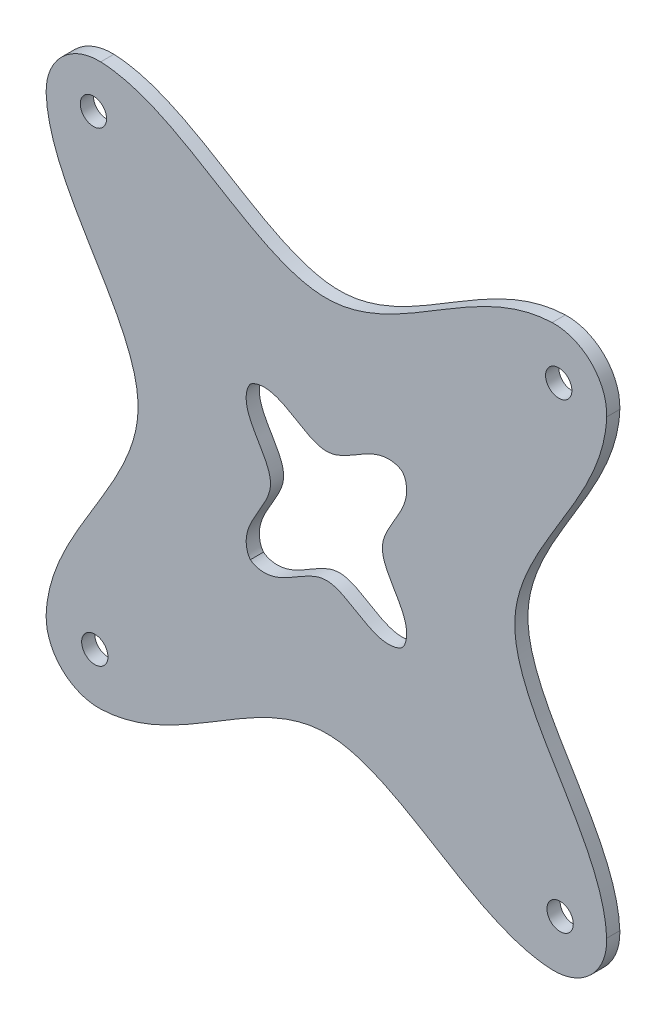
ISO-10303-21;
HEADER;
FILE_DESCRIPTION(('STEP AP214'),'2;1');
FILE_NAME('part.step','',(''),(''),'','','');
FILE_SCHEMA(('AUTOMOTIVE_DESIGN { 1 0 10303 214 1 1 1 1 }'));
ENDSEC;
DATA;
#1=APPLICATION_CONTEXT('core data for automotive mechanical design processes');
#2=APPLICATION_PROTOCOL_DEFINITION('international standard','automotive_design',2000,#1);
#3=PRODUCT_CONTEXT('',#1,'mechanical');
#4=PRODUCT('Part','Part','',(#3));
#5=PRODUCT_RELATED_PRODUCT_CATEGORY('part','',(#4));
#6=PRODUCT_DEFINITION_FORMATION('','',#4);
#7=PRODUCT_DEFINITION_CONTEXT('part definition',#1,'design');
#8=PRODUCT_DEFINITION('design','',#6,#7);
#9=PRODUCT_DEFINITION_SHAPE('','',#8);
#10=(LENGTH_UNIT() NAMED_UNIT(*) SI_UNIT(.MILLI.,.METRE.));
#11=(NAMED_UNIT(*) PLANE_ANGLE_UNIT() SI_UNIT($,.RADIAN.));
#12=(NAMED_UNIT(*) SI_UNIT($,.STERADIAN.) SOLID_ANGLE_UNIT());
#13=UNCERTAINTY_MEASURE_WITH_UNIT(LENGTH_MEASURE(1.E-05),#10,'distance_accuracy_value','');
#14=(GEOMETRIC_REPRESENTATION_CONTEXT(3) GLOBAL_UNCERTAINTY_ASSIGNED_CONTEXT((#13)) GLOBAL_UNIT_ASSIGNED_CONTEXT((#10,
#11,#12)) REPRESENTATION_CONTEXT('',''));
#15=CARTESIAN_POINT('',(0.,0.,0.));
#16=DIRECTION('',(0.,0.,1.));
#17=DIRECTION('',(1.,0.,0.));
#18=AXIS2_PLACEMENT_3D('',#15,#16,#17);
#19=CARTESIAN_POINT('',(21.9654081761549,-21.9654081758046,0.));
#20=DIRECTION('',(0.,0.,-1.));
#21=DIRECTION('',(-1.,0.,0.));
#22=AXIS2_PLACEMENT_3D('',#19,#20,#21);
#23=CYLINDRICAL_SURFACE('',#22,5.08);
#24=DIRECTION('',(0.,0.,-1.));
#25=VECTOR('',#24,1.);
#26=CARTESIAN_POINT('',(21.7825332933206,-27.0421154528917,0.));
#27=LINE('',#26,#25);
#28=CARTESIAN_POINT('',(21.7825332933206,-27.0421154528917,0.));
#29=VERTEX_POINT('',#28);
#30=CARTESIAN_POINT('',(21.7825332933206,-27.0421154528917,1.27));
#31=VERTEX_POINT('',#30);
#32=EDGE_CURVE('E259',#29,#31,#27,.F.);
#33=ORIENTED_EDGE('',*,*,#32,.F.);
#34=CARTESIAN_POINT('',(21.9654081761549,-21.9654081758046,0.));
#35=DIRECTION('',(0.,0.,1.));
#36=DIRECTION('',(1.,0.,0.));
#37=AXIS2_PLACEMENT_3D('',#34,#35,#36);
#38=CIRCLE('',#37,5.08);
#39=CARTESIAN_POINT('',(27.0421154532867,-21.782533294215,0.));
#40=VERTEX_POINT('',#39);
#41=EDGE_CURVE('E40',#40,#29,#38,.F.);
#42=ORIENTED_EDGE('',*,*,#41,.F.);
#43=DIRECTION('',(0.,0.,-1.));
#44=VECTOR('',#43,1.);
#45=CARTESIAN_POINT('',(27.0421154532867,-21.782533294215,1.27));
#46=LINE('',#45,#44);
#47=CARTESIAN_POINT('',(27.0421154532867,-21.782533294215,1.27));
#48=VERTEX_POINT('',#47);
#49=EDGE_CURVE('E262',#48,#40,#46,.T.);
#50=ORIENTED_EDGE('',*,*,#49,.F.);
#51=CARTESIAN_POINT('',(21.9654081761549,-21.9654081758046,1.27));
#52=DIRECTION('',(0.,0.,1.));
#53=DIRECTION('',(1.,0.,0.));
#54=AXIS2_PLACEMENT_3D('',#51,#52,#53);
#55=CIRCLE('',#54,5.08);
#56=EDGE_CURVE('E11',#31,#48,#55,.T.);
#57=ORIENTED_EDGE('',*,*,#56,.F.);
#58=EDGE_LOOP('',(#33,#42,#50,#57));
#59=FACE_BOUND('',#58,.T.);
#60=ADVANCED_FACE('F33',(#59),#23,.T.);
#61=CARTESIAN_POINT('',(-21.9654081757839,21.965408175578,1.27));
#62=DIRECTION('',(0.,0.,-1.));
#63=DIRECTION('',(-1.,0.,0.));
#64=AXIS2_PLACEMENT_3D('',#61,#62,#63);
#65=CYLINDRICAL_SURFACE('',#64,5.08);
#66=DIRECTION('',(0.,0.,-1.));
#67=VECTOR('',#66,1.);
#68=CARTESIAN_POINT('',(-27.0421154528519,21.7825332922171,1.27));
#69=LINE('',#68,#67);
#70=CARTESIAN_POINT('',(-27.0421154528519,21.7825332922171,1.27));
#71=VERTEX_POINT('',#70);
#72=CARTESIAN_POINT('',(-27.0421154528519,21.7825332922171,0.));
#73=VERTEX_POINT('',#72);
#74=EDGE_CURVE('E249',#71,#73,#69,.T.);
#75=ORIENTED_EDGE('',*,*,#74,.F.);
#76=CARTESIAN_POINT('',(-21.9654081757839,21.965408175578,1.27));
#77=DIRECTION('',(0.,0.,1.));
#78=DIRECTION('',(1.,0.,0.));
#79=AXIS2_PLACEMENT_3D('',#76,#77,#78);
#80=CIRCLE('',#79,5.08);
#81=CARTESIAN_POINT('',(-21.7825332916942,27.0421154526198,1.27));
#82=VERTEX_POINT('',#81);
#83=EDGE_CURVE('E255',#82,#71,#80,.T.);
#84=ORIENTED_EDGE('',*,*,#83,.F.);
#85=DIRECTION('',(0.,0.,-1.));
#86=VECTOR('',#85,1.);
#87=CARTESIAN_POINT('',(-21.7825332916942,27.0421154526198,0.));
#88=LINE('',#87,#86);
#89=CARTESIAN_POINT('',(-21.7825332916942,27.0421154526198,0.));
#90=VERTEX_POINT('',#89);
#91=EDGE_CURVE('E252',#90,#82,#88,.F.);
#92=ORIENTED_EDGE('',*,*,#91,.F.);
#93=CARTESIAN_POINT('',(-21.9654081757839,21.965408175578,0.));
#94=DIRECTION('',(0.,0.,1.));
#95=DIRECTION('',(1.,0.,0.));
#96=AXIS2_PLACEMENT_3D('',#93,#94,#95);
#97=CIRCLE('',#96,5.08);
#98=EDGE_CURVE('E257',#73,#90,#97,.F.);
#99=ORIENTED_EDGE('',*,*,#98,.F.);
#100=EDGE_LOOP('',(#75,#84,#92,#99));
#101=FACE_BOUND('',#100,.T.);
#102=ADVANCED_FACE('F288',(#101),#65,.T.);
#103=CARTESIAN_POINT('',(-21.9654081755703,-21.9654081755702,1.27));
#104=DIRECTION('',(0.,0.,-1.));
#105=DIRECTION('',(-1.,0.,0.));
#106=AXIS2_PLACEMENT_3D('',#103,#104,#105);
#107=CYLINDRICAL_SURFACE('',#106,5.08);
#108=DIRECTION('',(0.,0.,-1.));
#109=VECTOR('',#108,1.);
#110=CARTESIAN_POINT('',(-21.7825332912855,-27.042115452605,1.27));
#111=LINE('',#110,#109);
#112=CARTESIAN_POINT('',(-21.7825332912855,-27.042115452605,1.27));
#113=VERTEX_POINT('',#112);
#114=CARTESIAN_POINT('',(-21.7825332912855,-27.042115452605,0.));
#115=VERTEX_POINT('',#114);
#116=EDGE_CURVE('E238',#113,#115,#111,.T.);
#117=ORIENTED_EDGE('',*,*,#116,.F.);
#118=CARTESIAN_POINT('',(-21.9654081755703,-21.9654081755702,1.27));
#119=DIRECTION('',(0.,0.,1.));
#120=DIRECTION('',(1.,0.,0.));
#121=AXIS2_PLACEMENT_3D('',#118,#119,#120);
#122=CIRCLE('',#121,5.08);
#123=CARTESIAN_POINT('',(-27.042115452605,-21.7825332912856,1.27));
#124=VERTEX_POINT('',#123);
#125=EDGE_CURVE('E244',#124,#113,#122,.T.);
#126=ORIENTED_EDGE('',*,*,#125,.F.);
#127=DIRECTION('',(0.,0.,-1.));
#128=VECTOR('',#127,1.);
#129=CARTESIAN_POINT('',(-27.042115452605,-21.7825332912856,0.));
#130=LINE('',#129,#128);
#131=CARTESIAN_POINT('',(-27.042115452605,-21.7825332912856,0.));
#132=VERTEX_POINT('',#131);
#133=EDGE_CURVE('E241',#132,#124,#130,.F.);
#134=ORIENTED_EDGE('',*,*,#133,.F.);
#135=CARTESIAN_POINT('',(-21.9654081755703,-21.9654081755702,0.));
#136=DIRECTION('',(0.,0.,1.));
#137=DIRECTION('',(1.,0.,0.));
#138=AXIS2_PLACEMENT_3D('',#135,#136,#137);
#139=CIRCLE('',#138,5.08);
#140=EDGE_CURVE('E246',#115,#132,#139,.F.);
#141=ORIENTED_EDGE('',*,*,#140,.F.);
#142=EDGE_LOOP('',(#117,#126,#134,#141));
#143=FACE_BOUND('',#142,.T.);
#144=ADVANCED_FACE('F278',(#143),#107,.T.);
#145=CARTESIAN_POINT('',(21.965408175107,21.9654081757669,0.));
#146=DIRECTION('',(0.,0.,-1.));
#147=DIRECTION('',(-1.,0.,0.));
#148=AXIS2_PLACEMENT_3D('',#145,#146,#147);
#149=CYLINDRICAL_SURFACE('',#148,5.08);
#150=DIRECTION('',(0.,0.,-1.));
#151=VECTOR('',#150,1.);
#152=CARTESIAN_POINT('',(27.0421154520755,21.7825332896429,0.));
#153=LINE('',#152,#151);
#154=CARTESIAN_POINT('',(27.0421154520755,21.7825332896429,0.));
#155=VERTEX_POINT('',#154);
#156=CARTESIAN_POINT('',(27.0421154520755,21.7825332896429,1.27));
#157=VERTEX_POINT('',#156);
#158=EDGE_CURVE('E187',#155,#157,#153,.F.);
#159=ORIENTED_EDGE('',*,*,#158,.F.);
#160=CARTESIAN_POINT('',(21.965408175107,21.9654081757669,0.));
#161=DIRECTION('',(0.,0.,1.));
#162=DIRECTION('',(1.,0.,0.));
#163=AXIS2_PLACEMENT_3D('',#160,#161,#162);
#164=CIRCLE('',#163,5.08);
#165=CARTESIAN_POINT('',(21.7825332913162,27.0421154528195,0.));
#166=VERTEX_POINT('',#165);
#167=EDGE_CURVE('E233',#166,#155,#164,.F.);
#168=ORIENTED_EDGE('',*,*,#167,.F.);
#169=DIRECTION('',(0.,0.,-1.));
#170=VECTOR('',#169,1.);
#171=CARTESIAN_POINT('',(21.7825332913162,27.0421154528195,1.27));
#172=LINE('',#171,#170);
#173=CARTESIAN_POINT('',(21.7825332913162,27.0421154528195,1.27));
#174=VERTEX_POINT('',#173);
#175=EDGE_CURVE('E230',#174,#166,#172,.T.);
#176=ORIENTED_EDGE('',*,*,#175,.F.);
#177=CARTESIAN_POINT('',(21.965408175107,21.9654081757669,1.27));
#178=DIRECTION('',(0.,0.,1.));
#179=DIRECTION('',(1.,0.,0.));
#180=AXIS2_PLACEMENT_3D('',#177,#178,#179);
#181=CIRCLE('',#180,5.08);
#182=EDGE_CURVE('E236',#157,#174,#181,.T.);
#183=ORIENTED_EDGE('',*,*,#182,.F.);
#184=EDGE_LOOP('',(#159,#168,#176,#183));
#185=FACE_BOUND('',#184,.T.);
#186=ADVANCED_FACE('F294',(#185),#149,.T.);
#187=CARTESIAN_POINT('',(-26.0784512242138,26.0784512242138,1.27));
#188=CARTESIAN_POINT('',(-26.4668926901077,25.5950306717712,1.27));
#189=CARTESIAN_POINT('',(-29.5054367703831,16.2013722905775,1.27));
#190=CARTESIAN_POINT('',(-7.63665032782753,4.97957528785472E-10,1.27));
#191=CARTESIAN_POINT('',(-29.505436769622,-16.2013722917142,1.27));
#192=CARTESIAN_POINT('',(-26.4668926901906,-25.5950306717568,1.27));
#193=CARTESIAN_POINT('',(-26.0784512242138,-26.0784512242138,1.27));
#194=B_SPLINE_CURVE_WITH_KNOTS('',3,(#187,#188,#189,#190,#191,#192,#193),.UNSPECIFIED.,.F.,.F.,
(4,1,1,1,4),(0.0327667540954913,0.0655335081872653,0.49999999999634,0.934466491805415,
0.967233245900849),.UNSPECIFIED.);
#195=DIRECTION('',(0.,0.,-1.));
#196=VECTOR('',#195,1.);
#197=SURFACE_OF_LINEAR_EXTRUSION('',#194,#196);
#198=EDGE_CURVE('E224',#71,#124,#194,.T.);
#199=ORIENTED_EDGE('',*,*,#198,.F.);
#200=ORIENTED_EDGE('',*,*,#74,.T.);
#201=CARTESIAN_POINT('',(-26.0784512242138,26.0784512242138,0.));
#202=CARTESIAN_POINT('',(-26.4668926901077,25.5950306717712,0.));
#203=CARTESIAN_POINT('',(-29.5054367703831,16.2013722905775,0.));
#204=CARTESIAN_POINT('',(-7.63665032782753,4.97957528785472E-10,0.));
#205=CARTESIAN_POINT('',(-29.505436769622,-16.2013722917142,0.));
#206=CARTESIAN_POINT('',(-26.4668926901906,-25.5950306717568,0.));
#207=CARTESIAN_POINT('',(-26.0784512242138,-26.0784512242138,0.));
#208=B_SPLINE_CURVE_WITH_KNOTS('',3,(#201,#202,#203,#204,#205,#206,#207),.UNSPECIFIED.,.F.,.F.,
(4,1,1,1,4),(0.0327667540954913,0.0655335081872653,0.49999999999634,0.934466491805415,
0.967233245900849),.UNSPECIFIED.);
#209=EDGE_CURVE('E193',#73,#132,#208,.T.);
#210=ORIENTED_EDGE('',*,*,#209,.T.);
#211=ORIENTED_EDGE('',*,*,#133,.T.);
#212=EDGE_LOOP('',(#199,#200,#210,#211));
#213=FACE_BOUND('',#212,.T.);
#214=ADVANCED_FACE('F285',(#213),#197,.F.);
#215=CARTESIAN_POINT('',(-26.0784512242138,-26.0784512242138,1.27));
#216=CARTESIAN_POINT('',(-25.5950306717568,-26.4668926901906,1.27));
#217=CARTESIAN_POINT('',(-16.2013722917143,-29.5054367696219,1.27));
#218=CARTESIAN_POINT('',(4.97995116026007E-10,-7.63665032782758,1.27));
#219=CARTESIAN_POINT('',(16.2013722905775,-29.505436770383,1.27));
#220=CARTESIAN_POINT('',(25.5950306717712,-26.4668926901077,1.27));
#221=CARTESIAN_POINT('',(26.0784512242138,-26.0784512242138,1.27));
#222=B_SPLINE_CURVE_WITH_KNOTS('',3,(#215,#216,#217,#218,#219,#220,#221),.UNSPECIFIED.,.F.,.F.,
(4,1,1,1,4),(0.0327667540954913,0.0655335081909255,0.5,0.934466491809075,0.967233245900849),.UNSPECIFIED.);
#223=DIRECTION('',(0.,0.,-1.));
#224=VECTOR('',#223,1.);
#225=SURFACE_OF_LINEAR_EXTRUSION('',#222,#224);
#226=CARTESIAN_POINT('',(-26.0784512242138,-26.0784512242138,0.));
#227=CARTESIAN_POINT('',(-25.5950306717568,-26.4668926901906,0.));
#228=CARTESIAN_POINT('',(-16.2013722917143,-29.5054367696219,0.));
#229=CARTESIAN_POINT('',(4.97995116026007E-10,-7.63665032782758,0.));
#230=CARTESIAN_POINT('',(16.2013722905775,-29.505436770383,0.));
#231=CARTESIAN_POINT('',(25.5950306717712,-26.4668926901077,0.));
#232=CARTESIAN_POINT('',(26.0784512242138,-26.0784512242138,0.));
#233=B_SPLINE_CURVE_WITH_KNOTS('',3,(#226,#227,#228,#229,#230,#231,#232),.UNSPECIFIED.,.F.,.F.,
(4,1,1,1,4),(0.0327667540954913,0.0655335081909255,0.5,0.934466491809075,0.967233245900849),.UNSPECIFIED.);
#234=EDGE_CURVE('E200',#115,#29,#233,.T.);
#235=ORIENTED_EDGE('',*,*,#234,.T.);
#236=ORIENTED_EDGE('',*,*,#32,.T.);
#237=EDGE_CURVE('E275',#113,#31,#222,.T.);
#238=ORIENTED_EDGE('',*,*,#237,.F.);
#239=ORIENTED_EDGE('',*,*,#116,.T.);
#240=EDGE_LOOP('',(#235,#236,#238,#239));
#241=FACE_BOUND('',#240,.T.);
#242=ADVANCED_FACE('F273',(#241),#225,.F.);
#243=CARTESIAN_POINT('',(26.0784512242138,-26.0784512242138,1.27));
#244=CARTESIAN_POINT('',(26.4668926899683,-25.5950306717962,1.27));
#245=CARTESIAN_POINT('',(29.5054367716601,-16.201372288648,1.27));
#246=CARTESIAN_POINT('',(7.63665032804387,-2.44868862485965E-09,1.27));
#247=CARTESIAN_POINT('',(29.5054367679272,16.2013722942378,1.27));
#248=CARTESIAN_POINT('',(26.4668926903748,25.5950306717246,1.27));
#249=CARTESIAN_POINT('',(26.0784512242138,26.0784512242138,1.27));
#250=B_SPLINE_CURVE_WITH_KNOTS('',3,(#243,#244,#245,#246,#247,#248,#249),.UNSPECIFIED.,.F.,.F.,
(4,1,1,1,4),(0.0327667541053309,0.0655335081909253,0.5,0.934466491809075,0.967233245912644),.UNSPECIFIED.);
#251=DIRECTION('',(0.,0.,-1.));
#252=VECTOR('',#251,1.);
#253=SURFACE_OF_LINEAR_EXTRUSION('',#250,#252);
#254=EDGE_CURVE('E188',#48,#157,#250,.T.);
#255=ORIENTED_EDGE('',*,*,#254,.F.);
#256=ORIENTED_EDGE('',*,*,#49,.T.);
#257=CARTESIAN_POINT('',(26.0784512242138,-26.0784512242138,0.));
#258=CARTESIAN_POINT('',(26.4668926899683,-25.5950306717962,0.));
#259=CARTESIAN_POINT('',(29.5054367716601,-16.201372288648,0.));
#260=CARTESIAN_POINT('',(7.63665032804387,-2.44868862485965E-09,0.));
#261=CARTESIAN_POINT('',(29.5054367679272,16.2013722942378,0.));
#262=CARTESIAN_POINT('',(26.4668926903748,25.5950306717246,0.));
#263=CARTESIAN_POINT('',(26.0784512242138,26.0784512242138,0.));
#264=B_SPLINE_CURVE_WITH_KNOTS('',3,(#257,#258,#259,#260,#261,#262,#263),.UNSPECIFIED.,.F.,.F.,
(4,1,1,1,4),(0.0327667541053309,0.0655335081909253,0.5,0.934466491809075,0.967233245912644),.UNSPECIFIED.);
#265=EDGE_CURVE('E209',#40,#155,#264,.T.);
#266=ORIENTED_EDGE('',*,*,#265,.T.);
#267=ORIENTED_EDGE('',*,*,#158,.T.);
#268=EDGE_LOOP('',(#255,#256,#266,#267));
#269=FACE_BOUND('',#268,.T.);
#270=ADVANCED_FACE('F177',(#269),#253,.F.);
#271=CARTESIAN_POINT('',(26.0784512242138,26.0784512242138,1.27));
#272=CARTESIAN_POINT('',(25.5950306717712,26.4668926901077,1.27));
#273=CARTESIAN_POINT('',(16.2013722905775,29.5054367703831,1.27));
#274=CARTESIAN_POINT('',(4.97927742693554E-10,7.63665032782749,1.27));
#275=CARTESIAN_POINT('',(-16.2013722917142,29.505436769622,1.27));
#276=CARTESIAN_POINT('',(-25.5950306717568,26.4668926901906,1.27));
#277=CARTESIAN_POINT('',(-26.0784512242138,26.0784512242138,1.27));
#278=B_SPLINE_CURVE_WITH_KNOTS('',3,(#271,#272,#273,#274,#275,#276,#277),.UNSPECIFIED.,.F.,.F.,
(4,1,1,1,4),(0.0327667540954913,0.0655335081872656,0.49999999999634,0.934466491805415,
0.967233245900849),.UNSPECIFIED.);
#279=DIRECTION('',(0.,0.,-1.));
#280=VECTOR('',#279,1.);
#281=SURFACE_OF_LINEAR_EXTRUSION('',#278,#280);
#282=CARTESIAN_POINT('',(26.0784512242138,26.0784512242138,0.));
#283=CARTESIAN_POINT('',(25.5950306717712,26.4668926901077,0.));
#284=CARTESIAN_POINT('',(16.2013722905775,29.5054367703831,0.));
#285=CARTESIAN_POINT('',(4.97927742693554E-10,7.63665032782749,0.));
#286=CARTESIAN_POINT('',(-16.2013722917142,29.505436769622,0.));
#287=CARTESIAN_POINT('',(-25.5950306717568,26.4668926901906,0.));
#288=CARTESIAN_POINT('',(-26.0784512242138,26.0784512242138,0.));
#289=B_SPLINE_CURVE_WITH_KNOTS('',3,(#282,#283,#284,#285,#286,#287,#288),.UNSPECIFIED.,.F.,.F.,
(4,1,1,1,4),(0.0327667540954913,0.0655335081872656,0.49999999999634,0.934466491805415,
0.967233245900849),.UNSPECIFIED.);
#290=EDGE_CURVE('E216',#166,#90,#289,.T.);
#291=ORIENTED_EDGE('',*,*,#290,.T.);
#292=ORIENTED_EDGE('',*,*,#91,.T.);
#293=EDGE_CURVE('E181',#174,#82,#278,.T.);
#294=ORIENTED_EDGE('',*,*,#293,.F.);
#295=ORIENTED_EDGE('',*,*,#175,.T.);
#296=EDGE_LOOP('',(#291,#292,#294,#295));
#297=FACE_BOUND('',#296,.T.);
#298=ADVANCED_FACE('F169',(#297),#281,.F.);
#299=CARTESIAN_POINT('',(-18.1737,-9.863950377484E-11,1.27));
#300=DIRECTION('',(0.,0.,1.));
#301=DIRECTION('',(1.,0.,0.));
#302=AXIS2_PLACEMENT_3D('',#299,#300,#301);
#303=PLANE('',#302);
#304=CARTESIAN_POINT('',(22.4183175176677,22.3060062973351,1.27));
#305=DIRECTION('',(0.,0.,1.));
#306=DIRECTION('',(1.,0.,0.));
#307=AXIS2_PLACEMENT_3D('',#304,#305,#306);
#308=CIRCLE('',#307,1.27);
#309=CARTESIAN_POINT('',(23.6883175176677,22.3060062973351,1.27));
#310=VERTEX_POINT('',#309);
#311=EDGE_CURVE('E490',#310,#310,#308,.T.);
#312=ORIENTED_EDGE('',*,*,#311,.F.);
#313=EDGE_LOOP('',(#312));
#314=FACE_BOUND('',#313,.T.);
#315=CARTESIAN_POINT('',(22.5498132583037,-22.2051189848838,1.27));
#316=DIRECTION('',(0.,0.,1.));
#317=DIRECTION('',(1.,0.,0.));
#318=AXIS2_PLACEMENT_3D('',#315,#316,#317);
#319=CIRCLE('',#318,1.27);
#320=CARTESIAN_POINT('',(23.8198132583037,-22.2051189848838,1.27));
#321=VERTEX_POINT('',#320);
#322=EDGE_CURVE('E484',#321,#321,#319,.T.);
#323=ORIENTED_EDGE('',*,*,#322,.F.);
#324=EDGE_LOOP('',(#323));
#325=FACE_BOUND('',#324,.T.);
#326=CARTESIAN_POINT('',(-22.3512714120008,-22.3377667520884,1.27));
#327=DIRECTION('',(0.,0.,1.));
#328=DIRECTION('',(1.,0.,0.));
#329=AXIS2_PLACEMENT_3D('',#326,#327,#328);
#330=CIRCLE('',#329,1.27);
#331=CARTESIAN_POINT('',(-21.0812714120008,-22.3377667520884,1.27));
#332=VERTEX_POINT('',#331);
#333=EDGE_CURVE('E147',#332,#332,#330,.T.);
#334=ORIENTED_EDGE('',*,*,#333,.F.);
#335=EDGE_LOOP('',(#334));
#336=FACE_BOUND('',#335,.T.);
#337=CARTESIAN_POINT('',(-7.33692561210691,7.33692561210692,1.27));
#338=CARTESIAN_POINT('',(-7.53999049262532,7.09456495387122,1.27));
#339=CARTESIAN_POINT('',(-8.46751062910924,4.44168544808401,1.27));
#340=CARTESIAN_POINT('',(-2.70941912041999,-7.0008242387644E-12,1.27));
#341=CARTESIAN_POINT('',(-8.46751062911856,-4.44168544806627,1.27));
#342=CARTESIAN_POINT('',(-7.53999049262328,-7.09456495387186,1.27));
#343=CARTESIAN_POINT('',(-7.33692561210691,-7.33692561210691,1.27));
#344=B_SPLINE_CURVE_WITH_KNOTS('',3,(#337,#338,#339,#340,#341,#342,#343),.UNSPECIFIED.,.F.,.F.,
(4,1,1,1,4),(0.0553210234955911,0.110642046982983,0.5,0.889357953017018,0.944678976504082),.UNSPECIFIED.);
#345=CARTESIAN_POINT('',(-7.33692561210691,7.33692561210692,1.27));
#346=VERTEX_POINT('',#345);
#347=CARTESIAN_POINT('',(-7.33692561210691,-7.33692561210691,1.27));
#348=VERTEX_POINT('',#347);
#349=EDGE_CURVE('E47',#346,#348,#344,.T.);
#350=ORIENTED_EDGE('',*,*,#349,.F.);
#351=CARTESIAN_POINT('',(7.33692561210691,7.33692561210692,1.27));
#352=CARTESIAN_POINT('',(7.09456495387186,7.53999049262328,1.27));
#353=CARTESIAN_POINT('',(4.44168544806627,8.46751062911857,1.27));
#354=CARTESIAN_POINT('',(7.01949138263898E-12,2.70941912042,1.27));
#355=CARTESIAN_POINT('',(-4.44168544808406,8.46751062910922,1.27));
#356=CARTESIAN_POINT('',(-7.09456495387122,7.53999049262532,1.27));
#357=CARTESIAN_POINT('',(-7.33692561210691,7.33692561210692,1.27));
#358=B_SPLINE_CURVE_WITH_KNOTS('',3,(#351,#352,#353,#354,#355,#356,#357),.UNSPECIFIED.,.F.,.F.,
(4,1,1,1,4),(0.0553210234955904,0.110642046982654,0.499999999999672,0.889357953016689,
0.944678976504082),.UNSPECIFIED.);
#359=CARTESIAN_POINT('',(7.33692561210691,7.33692561210692,1.27));
#360=VERTEX_POINT('',#359);
#361=EDGE_CURVE('E138',#360,#346,#358,.T.);
#362=ORIENTED_EDGE('',*,*,#361,.F.);
#363=CARTESIAN_POINT('',(7.33692561210692,-7.33692561210691,1.27));
#364=CARTESIAN_POINT('',(7.53999049262328,-7.09456495387186,1.27));
#365=CARTESIAN_POINT('',(8.46751062911858,-4.44168544806627,1.27));
#366=CARTESIAN_POINT('',(2.70941912041998,-6.99550577533673E-12,1.27));
#367=CARTESIAN_POINT('',(8.46751062910925,4.44168544808402,1.27));
#368=CARTESIAN_POINT('',(7.53999049262532,7.09456495387123,1.27));
#369=CARTESIAN_POINT('',(7.33692561210691,7.33692561210692,1.27));
#370=B_SPLINE_CURVE_WITH_KNOTS('',3,(#363,#364,#365,#366,#367,#368,#369),.UNSPECIFIED.,.F.,.F.,
(4,1,1,1,4),(0.0553210234955905,0.110642046982655,0.499999999999672,0.88935795301669,
0.944678976504082),.UNSPECIFIED.);
#371=CARTESIAN_POINT('',(7.33692561210692,-7.33692561210691,1.27));
#372=VERTEX_POINT('',#371);
#373=EDGE_CURVE('E141',#372,#360,#370,.T.);
#374=ORIENTED_EDGE('',*,*,#373,.F.);
#375=CARTESIAN_POINT('',(-7.33692561210691,-7.33692561210691,1.27));
#376=CARTESIAN_POINT('',(-7.09456495387166,-7.5399904926263,1.27));
#377=CARTESIAN_POINT('',(-4.44168544808951,-8.4675106291081,1.27));
#378=CARTESIAN_POINT('',(9.9832975571161E-11,-2.70941912034422,1.27));
#379=CARTESIAN_POINT('',(4.441685447835,-8.46751062926177,1.27));
#380=CARTESIAN_POINT('',(7.09456495387715,-7.53999049259185,1.27));
#381=CARTESIAN_POINT('',(7.33692561210692,-7.33692561210691,1.27));
#382=B_SPLINE_CURVE_WITH_KNOTS('',3,(#375,#376,#377,#378,#379,#380,#381),.UNSPECIFIED.,.F.,.F.,
(4,1,1,1,4),(0.0553210234955125,0.110642046982982,0.5,0.889357953017018,0.944678976499516),.UNSPECIFIED.);
#383=EDGE_CURVE('E440',#348,#372,#382,.T.);
#384=ORIENTED_EDGE('',*,*,#383,.F.);
#385=EDGE_LOOP('',(#350,#362,#374,#384));
#386=FACE_BOUND('',#385,.T.);
#387=CARTESIAN_POINT('',(-22.4839191792056,22.5633179182161,1.27));
#388=DIRECTION('',(0.,0.,1.));
#389=DIRECTION('',(1.,0.,0.));
#390=AXIS2_PLACEMENT_3D('',#387,#388,#389);
#391=CIRCLE('',#390,1.27);
#392=CARTESIAN_POINT('',(-21.2139191792056,22.5633179182161,1.27));
#393=VERTEX_POINT('',#392);
#394=EDGE_CURVE('E465',#393,#393,#391,.T.);
#395=ORIENTED_EDGE('',*,*,#394,.F.);
#396=EDGE_LOOP('',(#395));
#397=FACE_BOUND('',#396,.T.);
#398=ORIENTED_EDGE('',*,*,#237,.T.);
#399=ORIENTED_EDGE('',*,*,#56,.T.);
#400=ORIENTED_EDGE('',*,*,#254,.T.);
#401=ORIENTED_EDGE('',*,*,#182,.T.);
#402=ORIENTED_EDGE('',*,*,#293,.T.);
#403=ORIENTED_EDGE('',*,*,#83,.T.);
#404=ORIENTED_EDGE('',*,*,#198,.T.);
#405=ORIENTED_EDGE('',*,*,#125,.T.);
#406=EDGE_LOOP('',(#398,#399,#400,#401,#402,#403,#404,#405));
#407=FACE_BOUND('',#406,.T.);
#408=ADVANCED_FACE('F166',(#314,#325,#336,#386,#397,#407),#303,.T.);
#409=CARTESIAN_POINT('',(-18.1737,-9.863950377484E-11,0.));
#410=DIRECTION('',(0.,0.,1.));
#411=DIRECTION('',(1.,0.,0.));
#412=AXIS2_PLACEMENT_3D('',#409,#410,#411);
#413=PLANE('',#412);
#414=CARTESIAN_POINT('',(22.4183175176677,22.3060062973351,0.));
#415=DIRECTION('',(0.,0.,1.));
#416=DIRECTION('',(1.,0.,0.));
#417=AXIS2_PLACEMENT_3D('',#414,#415,#416);
#418=CIRCLE('',#417,1.27);
#419=CARTESIAN_POINT('',(23.6883175176677,22.3060062973351,0.));
#420=VERTEX_POINT('',#419);
#421=EDGE_CURVE('E487',#420,#420,#418,.T.);
#422=ORIENTED_EDGE('',*,*,#421,.T.);
#423=EDGE_LOOP('',(#422));
#424=FACE_BOUND('',#423,.T.);
#425=CARTESIAN_POINT('',(22.5498132583037,-22.2051189848838,0.));
#426=DIRECTION('',(0.,0.,1.));
#427=DIRECTION('',(1.,0.,0.));
#428=AXIS2_PLACEMENT_3D('',#425,#426,#427);
#429=CIRCLE('',#428,1.27);
#430=CARTESIAN_POINT('',(23.8198132583037,-22.2051189848838,0.));
#431=VERTEX_POINT('',#430);
#432=EDGE_CURVE('E482',#431,#431,#429,.T.);
#433=ORIENTED_EDGE('',*,*,#432,.T.);
#434=EDGE_LOOP('',(#433));
#435=FACE_BOUND('',#434,.T.);
#436=CARTESIAN_POINT('',(-22.3512714120008,-22.3377667520884,0.));
#437=DIRECTION('',(0.,0.,1.));
#438=DIRECTION('',(1.,0.,0.));
#439=AXIS2_PLACEMENT_3D('',#436,#437,#438);
#440=CIRCLE('',#439,1.27);
#441=CARTESIAN_POINT('',(-21.0812714120008,-22.3377667520884,0.));
#442=VERTEX_POINT('',#441);
#443=EDGE_CURVE('E441',#442,#442,#440,.T.);
#444=ORIENTED_EDGE('',*,*,#443,.T.);
#445=EDGE_LOOP('',(#444));
#446=FACE_BOUND('',#445,.T.);
#447=CARTESIAN_POINT('',(7.33692561210691,7.33692561210692,0.));
#448=CARTESIAN_POINT('',(7.09456495387186,7.53999049262328,0.));
#449=CARTESIAN_POINT('',(4.44168544806627,8.46751062911857,0.));
#450=CARTESIAN_POINT('',(7.01949138263898E-12,2.70941912042,0.));
#451=CARTESIAN_POINT('',(-4.44168544808406,8.46751062910922,0.));
#452=CARTESIAN_POINT('',(-7.09456495387122,7.53999049262532,0.));
#453=CARTESIAN_POINT('',(-7.33692561210691,7.33692561210692,0.));
#454=B_SPLINE_CURVE_WITH_KNOTS('',3,(#447,#448,#449,#450,#451,#452,#453),.UNSPECIFIED.,.F.,.F.,
(4,1,1,1,4),(0.0553210234955904,0.110642046982654,0.499999999999672,0.889357953016689,
0.944678976504082),.UNSPECIFIED.);
#455=CARTESIAN_POINT('',(7.33692561210691,7.33692561210692,0.));
#456=VERTEX_POINT('',#455);
#457=CARTESIAN_POINT('',(-7.33692561210691,7.33692561210692,0.));
#458=VERTEX_POINT('',#457);
#459=EDGE_CURVE('E128',#456,#458,#454,.T.);
#460=ORIENTED_EDGE('',*,*,#459,.T.);
#461=CARTESIAN_POINT('',(-7.33692561210691,7.33692561210692,0.));
#462=CARTESIAN_POINT('',(-7.53999049262532,7.09456495387122,0.));
#463=CARTESIAN_POINT('',(-8.46751062910924,4.44168544808401,0.));
#464=CARTESIAN_POINT('',(-2.70941912041999,-7.0008242387644E-12,0.));
#465=CARTESIAN_POINT('',(-8.46751062911856,-4.44168544806627,0.));
#466=CARTESIAN_POINT('',(-7.53999049262328,-7.09456495387186,0.));
#467=CARTESIAN_POINT('',(-7.33692561210691,-7.33692561210691,0.));
#468=B_SPLINE_CURVE_WITH_KNOTS('',3,(#461,#462,#463,#464,#465,#466,#467),.UNSPECIFIED.,.F.,.F.,
(4,1,1,1,4),(0.0553210234955911,0.110642046982983,0.5,0.889357953017018,0.944678976504082),.UNSPECIFIED.);
#469=CARTESIAN_POINT('',(-7.33692561210691,-7.33692561210691,0.));
#470=VERTEX_POINT('',#469);
#471=EDGE_CURVE('E122',#458,#470,#468,.T.);
#472=ORIENTED_EDGE('',*,*,#471,.T.);
#473=CARTESIAN_POINT('',(-7.33692561210691,-7.33692561210691,0.));
#474=CARTESIAN_POINT('',(-7.09456495387166,-7.5399904926263,0.));
#475=CARTESIAN_POINT('',(-4.44168544808951,-8.4675106291081,0.));
#476=CARTESIAN_POINT('',(9.9832975571161E-11,-2.70941912034422,0.));
#477=CARTESIAN_POINT('',(4.441685447835,-8.46751062926177,0.));
#478=CARTESIAN_POINT('',(7.09456495387715,-7.53999049259185,0.));
#479=CARTESIAN_POINT('',(7.33692561210692,-7.33692561210691,0.));
#480=B_SPLINE_CURVE_WITH_KNOTS('',3,(#473,#474,#475,#476,#477,#478,#479),.UNSPECIFIED.,.F.,.F.,
(4,1,1,1,4),(0.0553210234955125,0.110642046982982,0.5,0.889357953017018,0.944678976499516),.UNSPECIFIED.);
#481=CARTESIAN_POINT('',(7.33692561210692,-7.33692561210691,0.));
#482=VERTEX_POINT('',#481);
#483=EDGE_CURVE('E131',#470,#482,#480,.T.);
#484=ORIENTED_EDGE('',*,*,#483,.T.);
#485=CARTESIAN_POINT('',(7.33692561210692,-7.33692561210691,0.));
#486=CARTESIAN_POINT('',(7.53999049262328,-7.09456495387186,0.));
#487=CARTESIAN_POINT('',(8.46751062911858,-4.44168544806627,0.));
#488=CARTESIAN_POINT('',(2.70941912041998,-6.99550577533673E-12,0.));
#489=CARTESIAN_POINT('',(8.46751062910925,4.44168544808402,0.));
#490=CARTESIAN_POINT('',(7.53999049262532,7.09456495387123,0.));
#491=CARTESIAN_POINT('',(7.33692561210691,7.33692561210692,0.));
#492=B_SPLINE_CURVE_WITH_KNOTS('',3,(#485,#486,#487,#488,#489,#490,#491),.UNSPECIFIED.,.F.,.F.,
(4,1,1,1,4),(0.0553210234955905,0.110642046982655,0.499999999999672,0.88935795301669,
0.944678976504082),.UNSPECIFIED.);
#493=EDGE_CURVE('E55',#482,#456,#492,.T.);
#494=ORIENTED_EDGE('',*,*,#493,.T.);
#495=EDGE_LOOP('',(#460,#472,#484,#494));
#496=FACE_BOUND('',#495,.T.);
#497=CARTESIAN_POINT('',(-22.4839191792056,22.5633179182161,0.));
#498=DIRECTION('',(0.,0.,1.));
#499=DIRECTION('',(1.,0.,0.));
#500=AXIS2_PLACEMENT_3D('',#497,#498,#499);
#501=CIRCLE('',#500,1.27);
#502=CARTESIAN_POINT('',(-21.2139191792056,22.5633179182161,0.));
#503=VERTEX_POINT('',#502);
#504=EDGE_CURVE('E201',#503,#503,#501,.T.);
#505=ORIENTED_EDGE('',*,*,#504,.T.);
#506=EDGE_LOOP('',(#505));
#507=FACE_BOUND('',#506,.T.);
#508=ORIENTED_EDGE('',*,*,#265,.F.);
#509=ORIENTED_EDGE('',*,*,#41,.T.);
#510=ORIENTED_EDGE('',*,*,#234,.F.);
#511=ORIENTED_EDGE('',*,*,#140,.T.);
#512=ORIENTED_EDGE('',*,*,#209,.F.);
#513=ORIENTED_EDGE('',*,*,#98,.T.);
#514=ORIENTED_EDGE('',*,*,#290,.F.);
#515=ORIENTED_EDGE('',*,*,#167,.T.);
#516=EDGE_LOOP('',(#508,#509,#510,#511,#512,#513,#514,#515));
#517=FACE_BOUND('',#516,.T.);
#518=ADVANCED_FACE('F135',(#424,#435,#446,#496,#507,#517),#413,.F.);
#519=CARTESIAN_POINT('',(-22.4839191792056,22.5633179182161,0.));
#520=DIRECTION('',(0.,0.,1.));
#521=DIRECTION('',(1.,0.,0.));
#522=AXIS2_PLACEMENT_3D('',#519,#520,#521);
#523=CYLINDRICAL_SURFACE('',#522,1.27);
#524=ORIENTED_EDGE('',*,*,#504,.F.);
#525=EDGE_LOOP('',(#524));
#526=FACE_BOUND('',#525,.T.);
#527=ORIENTED_EDGE('',*,*,#394,.T.);
#528=EDGE_LOOP('',(#527));
#529=FACE_BOUND('',#528,.T.);
#530=ADVANCED_FACE('F161',(#526,#529),#523,.F.);
#531=DIRECTION('',(0.,0.,1.));
#532=VECTOR('',#531,1.);
#533=SURFACE_OF_LINEAR_EXTRUSION('',#468,#532);
#534=ORIENTED_EDGE('',*,*,#349,.T.);
#535=DIRECTION('',(0.,0.,1.));
#536=VECTOR('',#535,1.);
#537=CARTESIAN_POINT('',(-7.33692561210691,-7.33692561210691,0.));
#538=LINE('',#537,#536);
#539=EDGE_CURVE('E118',#470,#348,#538,.T.);
#540=ORIENTED_EDGE('',*,*,#539,.F.);
#541=ORIENTED_EDGE('',*,*,#471,.F.);
#542=DIRECTION('',(0.,0.,1.));
#543=VECTOR('',#542,1.);
#544=CARTESIAN_POINT('',(-7.33692561210691,7.33692561210692,0.));
#545=LINE('',#544,#543);
#546=EDGE_CURVE('E460',#458,#346,#545,.T.);
#547=ORIENTED_EDGE('',*,*,#546,.T.);
#548=EDGE_LOOP('',(#534,#540,#541,#547));
#549=FACE_BOUND('',#548,.T.);
#550=ADVANCED_FACE('F120',(#549),#533,.F.);
#551=DIRECTION('',(0.,0.,1.));
#552=VECTOR('',#551,1.);
#553=SURFACE_OF_LINEAR_EXTRUSION('',#454,#552);
#554=ORIENTED_EDGE('',*,*,#361,.T.);
#555=ORIENTED_EDGE('',*,*,#546,.F.);
#556=ORIENTED_EDGE('',*,*,#459,.F.);
#557=DIRECTION('',(0.,0.,1.));
#558=VECTOR('',#557,1.);
#559=CARTESIAN_POINT('',(7.33692561210691,7.33692561210692,0.));
#560=LINE('',#559,#558);
#561=EDGE_CURVE('E466',#456,#360,#560,.T.);
#562=ORIENTED_EDGE('',*,*,#561,.T.);
#563=EDGE_LOOP('',(#554,#555,#556,#562));
#564=FACE_BOUND('',#563,.T.);
#565=ADVANCED_FACE('F160',(#564),#553,.F.);
#566=DIRECTION('',(0.,0.,1.));
#567=VECTOR('',#566,1.);
#568=SURFACE_OF_LINEAR_EXTRUSION('',#492,#567);
#569=ORIENTED_EDGE('',*,*,#373,.T.);
#570=ORIENTED_EDGE('',*,*,#561,.F.);
#571=ORIENTED_EDGE('',*,*,#493,.F.);
#572=DIRECTION('',(0.,0.,1.));
#573=VECTOR('',#572,1.);
#574=CARTESIAN_POINT('',(7.33692561210692,-7.33692561210691,0.));
#575=LINE('',#574,#573);
#576=EDGE_CURVE('E127',#482,#372,#575,.T.);
#577=ORIENTED_EDGE('',*,*,#576,.T.);
#578=EDGE_LOOP('',(#569,#570,#571,#577));
#579=FACE_BOUND('',#578,.T.);
#580=ADVANCED_FACE('F375',(#579),#568,.F.);
#581=DIRECTION('',(0.,0.,1.));
#582=VECTOR('',#581,1.);
#583=SURFACE_OF_LINEAR_EXTRUSION('',#480,#582);
#584=ORIENTED_EDGE('',*,*,#383,.T.);
#585=ORIENTED_EDGE('',*,*,#576,.F.);
#586=ORIENTED_EDGE('',*,*,#483,.F.);
#587=ORIENTED_EDGE('',*,*,#539,.T.);
#588=EDGE_LOOP('',(#584,#585,#586,#587));
#589=FACE_BOUND('',#588,.T.);
#590=ADVANCED_FACE('F132',(#589),#583,.F.);
#591=CARTESIAN_POINT('',(-22.3512714120008,-22.3377667520884,0.));
#592=DIRECTION('',(0.,0.,1.));
#593=DIRECTION('',(1.,0.,0.));
#594=AXIS2_PLACEMENT_3D('',#591,#592,#593);
#595=CYLINDRICAL_SURFACE('',#594,1.27);
#596=ORIENTED_EDGE('',*,*,#443,.F.);
#597=EDGE_LOOP('',(#596));
#598=FACE_BOUND('',#597,.T.);
#599=ORIENTED_EDGE('',*,*,#333,.T.);
#600=EDGE_LOOP('',(#599));
#601=FACE_BOUND('',#600,.T.);
#602=ADVANCED_FACE('F392',(#598,#601),#595,.F.);
#603=CARTESIAN_POINT('',(22.5498132583037,-22.2051189848838,0.));
#604=DIRECTION('',(0.,0.,1.));
#605=DIRECTION('',(1.,0.,0.));
#606=AXIS2_PLACEMENT_3D('',#603,#604,#605);
#607=CYLINDRICAL_SURFACE('',#606,1.27);
#608=ORIENTED_EDGE('',*,*,#432,.F.);
#609=EDGE_LOOP('',(#608));
#610=FACE_BOUND('',#609,.T.);
#611=ORIENTED_EDGE('',*,*,#322,.T.);
#612=EDGE_LOOP('',(#611));
#613=FACE_BOUND('',#612,.T.);
#614=ADVANCED_FACE('F400',(#610,#613),#607,.F.);
#615=CARTESIAN_POINT('',(22.4183175176677,22.3060062973351,0.));
#616=DIRECTION('',(0.,0.,1.));
#617=DIRECTION('',(1.,0.,0.));
#618=AXIS2_PLACEMENT_3D('',#615,#616,#617);
#619=CYLINDRICAL_SURFACE('',#618,1.27);
#620=ORIENTED_EDGE('',*,*,#421,.F.);
#621=EDGE_LOOP('',(#620));
#622=FACE_BOUND('',#621,.T.);
#623=ORIENTED_EDGE('',*,*,#311,.T.);
#624=EDGE_LOOP('',(#623));
#625=FACE_BOUND('',#624,.T.);
#626=ADVANCED_FACE('F410',(#622,#625),#619,.F.);
#627=CLOSED_SHELL('',(#60,#102,#144,#186,#214,#242,#270,#298,#408,#518,#530,#550,#565,#580,#590,
#602,#614,#626));
#628=MANIFOLD_SOLID_BREP('B2',#627);
#629=ADVANCED_BREP_SHAPE_REPRESENTATION('',(#18,#628),#14);
#630=SHAPE_DEFINITION_REPRESENTATION(#9,#629);
ENDSEC;
END-ISO-10303-21;
